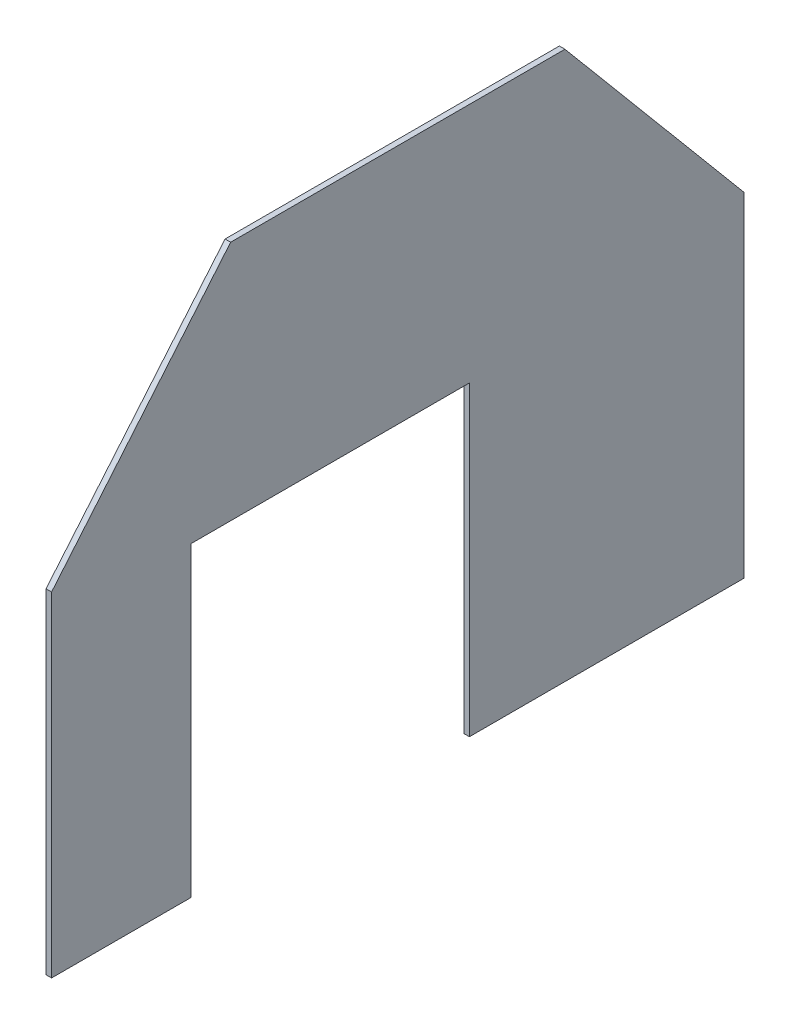
ISO-10303-21;
HEADER;
FILE_DESCRIPTION(('STEP AP214'),'2;1');
FILE_NAME('part.step','',(''),(''),'','','');
FILE_SCHEMA(('AUTOMOTIVE_DESIGN { 1 0 10303 214 1 1 1 1 }'));
ENDSEC;
DATA;
#1=APPLICATION_CONTEXT('core data for automotive mechanical design processes');
#2=APPLICATION_PROTOCOL_DEFINITION('international standard','automotive_design',2000,#1);
#3=PRODUCT_CONTEXT('',#1,'mechanical');
#4=PRODUCT('Part','Part','',(#3));
#5=PRODUCT_RELATED_PRODUCT_CATEGORY('part','',(#4));
#6=PRODUCT_DEFINITION_FORMATION('','',#4);
#7=PRODUCT_DEFINITION_CONTEXT('part definition',#1,'design');
#8=PRODUCT_DEFINITION('design','',#6,#7);
#9=PRODUCT_DEFINITION_SHAPE('','',#8);
#10=(LENGTH_UNIT() NAMED_UNIT(*) SI_UNIT(.MILLI.,.METRE.));
#11=(NAMED_UNIT(*) PLANE_ANGLE_UNIT() SI_UNIT($,.RADIAN.));
#12=(NAMED_UNIT(*) SI_UNIT($,.STERADIAN.) SOLID_ANGLE_UNIT());
#13=UNCERTAINTY_MEASURE_WITH_UNIT(LENGTH_MEASURE(1.E-05),#10,'distance_accuracy_value','');
#14=(GEOMETRIC_REPRESENTATION_CONTEXT(3) GLOBAL_UNCERTAINTY_ASSIGNED_CONTEXT((#13)) GLOBAL_UNIT_ASSIGNED_CONTEXT((#10,
#11,#12)) REPRESENTATION_CONTEXT('',''));
#15=CARTESIAN_POINT('',(0.,0.,0.));
#16=DIRECTION('',(0.,0.,1.));
#17=DIRECTION('',(1.,0.,0.));
#18=AXIS2_PLACEMENT_3D('',#15,#16,#17);
#19=CARTESIAN_POINT('',(-1.,0.,-124.278760968654));
#20=DIRECTION('',(0.,-1.,0.));
#21=DIRECTION('',(0.,0.,-1.));
#22=AXIS2_PLACEMENT_3D('',#19,#20,#21);
#23=PLANE('',#22);
#24=DIRECTION('',(1.,0.,0.));
#25=VECTOR('',#24,1.);
#26=CARTESIAN_POINT('',(-1.,0.,-75.));
#27=LINE('',#26,#25);
#28=CARTESIAN_POINT('',(-1.,0.,-75.));
#29=VERTEX_POINT('',#28);
#30=CARTESIAN_POINT('',(0.,0.,-75.));
#31=VERTEX_POINT('',#30);
#32=EDGE_CURVE('E169',#29,#31,#27,.T.);
#33=ORIENTED_EDGE('',*,*,#32,.F.);
#34=DIRECTION('',(0.,0.,-1.));
#35=VECTOR('',#34,1.);
#36=CARTESIAN_POINT('',(-1.,0.,-124.278760968654));
#37=LINE('',#36,#35);
#38=CARTESIAN_POINT('',(-1.,0.,-124.278760968654));
#39=VERTEX_POINT('',#38);
#40=EDGE_CURVE('E93',#29,#39,#37,.T.);
#41=ORIENTED_EDGE('',*,*,#40,.T.);
#42=DIRECTION('',(1.,0.,0.));
#43=VECTOR('',#42,1.);
#44=CARTESIAN_POINT('',(-1.,0.,-124.278760968654));
#45=LINE('',#44,#43);
#46=CARTESIAN_POINT('',(0.,0.,-124.278760968654));
#47=VERTEX_POINT('',#46);
#48=EDGE_CURVE('E39',#39,#47,#45,.T.);
#49=ORIENTED_EDGE('',*,*,#48,.T.);
#50=DIRECTION('',(0.,0.,-1.));
#51=VECTOR('',#50,1.);
#52=CARTESIAN_POINT('',(0.,0.,-124.278760968654));
#53=LINE('',#52,#51);
#54=EDGE_CURVE('E141',#31,#47,#53,.T.);
#55=ORIENTED_EDGE('',*,*,#54,.F.);
#56=EDGE_LOOP('',(#33,#41,#49,#55));
#57=FACE_BOUND('',#56,.T.);
#58=ADVANCED_FACE('F35',(#57),#23,.T.);
#59=DIRECTION('',(1.,0.,0.));
#60=VECTOR('',#59,1.);
#61=CARTESIAN_POINT('',(-1.,0.,-25.));
#62=LINE('',#61,#60);
#63=CARTESIAN_POINT('',(-1.,0.,-25.));
#64=VERTEX_POINT('',#63);
#65=CARTESIAN_POINT('',(0.,0.,-25.));
#66=VERTEX_POINT('',#65);
#67=EDGE_CURVE('E174',#64,#66,#62,.T.);
#68=ORIENTED_EDGE('',*,*,#67,.T.);
#69=CARTESIAN_POINT('',(0.,0.,0.));
#70=VERTEX_POINT('',#69);
#71=EDGE_CURVE('E137',#70,#66,#53,.T.);
#72=ORIENTED_EDGE('',*,*,#71,.F.);
#73=DIRECTION('',(1.,0.,0.));
#74=VECTOR('',#73,1.);
#75=CARTESIAN_POINT('',(-1.,0.,0.));
#76=LINE('',#75,#74);
#77=CARTESIAN_POINT('',(-1.,0.,0.));
#78=VERTEX_POINT('',#77);
#79=EDGE_CURVE('E11',#78,#70,#76,.T.);
#80=ORIENTED_EDGE('',*,*,#79,.F.);
#81=EDGE_CURVE('E184',#78,#64,#37,.T.);
#82=ORIENTED_EDGE('',*,*,#81,.T.);
#83=EDGE_LOOP('',(#68,#72,#80,#82));
#84=FACE_BOUND('',#83,.T.);
#85=ADVANCED_FACE('F37',(#84),#23,.T.);
#86=CARTESIAN_POINT('',(-1.,0.,0.));
#87=DIRECTION('',(0.,0.,1.));
#88=DIRECTION('',(1.,0.,0.));
#89=AXIS2_PLACEMENT_3D('',#86,#87,#88);
#90=PLANE('',#89);
#91=DIRECTION('',(0.,-1.,0.));
#92=VECTOR('',#91,1.);
#93=CARTESIAN_POINT('',(0.,0.,0.));
#94=LINE('',#93,#92);
#95=CARTESIAN_POINT('',(0.,60.,0.));
#96=VERTEX_POINT('',#95);
#97=EDGE_CURVE('E150',#96,#70,#94,.T.);
#98=ORIENTED_EDGE('',*,*,#97,.F.);
#99=DIRECTION('',(1.,0.,0.));
#100=VECTOR('',#99,1.);
#101=CARTESIAN_POINT('',(-1.,60.,0.));
#102=LINE('',#101,#100);
#103=CARTESIAN_POINT('',(-1.,60.,0.));
#104=VERTEX_POINT('',#103);
#105=EDGE_CURVE('E44',#104,#96,#102,.T.);
#106=ORIENTED_EDGE('',*,*,#105,.F.);
#107=DIRECTION('',(0.,-1.,0.));
#108=VECTOR('',#107,1.);
#109=CARTESIAN_POINT('',(-1.,0.,0.));
#110=LINE('',#109,#108);
#111=EDGE_CURVE('E127',#104,#78,#110,.T.);
#112=ORIENTED_EDGE('',*,*,#111,.T.);
#113=ORIENTED_EDGE('',*,*,#79,.T.);
#114=EDGE_LOOP('',(#98,#106,#112,#113));
#115=FACE_BOUND('',#114,.T.);
#116=ADVANCED_FACE('F188',(#115),#90,.T.);
#117=CARTESIAN_POINT('',(-1.,60.,0.));
#118=DIRECTION('',(0.,0.64278760968654,0.766044443118977));
#119=DIRECTION('',(0.,-0.766044443118977,0.64278760968654));
#120=AXIS2_PLACEMENT_3D('',#117,#118,#119);
#121=PLANE('',#120);
#122=DIRECTION('',(0.,-0.766044443118977,0.64278760968654));
#123=VECTOR('',#122,1.);
#124=CARTESIAN_POINT('',(0.,60.,0.));
#125=LINE('',#124,#123);
#126=CARTESIAN_POINT('',(0.,98.3022221559489,-32.139380484327));
#127=VERTEX_POINT('',#126);
#128=EDGE_CURVE('E113',#127,#96,#125,.T.);
#129=ORIENTED_EDGE('',*,*,#128,.F.);
#130=DIRECTION('',(1.,0.,0.));
#131=VECTOR('',#130,1.);
#132=CARTESIAN_POINT('',(-1.,98.3022221559489,-32.139380484327));
#133=LINE('',#132,#131);
#134=CARTESIAN_POINT('',(-1.,98.3022221559489,-32.139380484327));
#135=VERTEX_POINT('',#134);
#136=EDGE_CURVE('E107',#135,#127,#133,.T.);
#137=ORIENTED_EDGE('',*,*,#136,.F.);
#138=DIRECTION('',(0.,-0.766044443118977,0.64278760968654));
#139=VECTOR('',#138,1.);
#140=CARTESIAN_POINT('',(-1.,60.,0.));
#141=LINE('',#140,#139);
#142=EDGE_CURVE('E110',#135,#104,#141,.T.);
#143=ORIENTED_EDGE('',*,*,#142,.T.);
#144=ORIENTED_EDGE('',*,*,#105,.T.);
#145=EDGE_LOOP('',(#129,#137,#143,#144));
#146=FACE_BOUND('',#145,.T.);
#147=ADVANCED_FACE('F109',(#146),#121,.T.);
#148=CARTESIAN_POINT('',(-1.,98.3022221559489,-32.139380484327));
#149=DIRECTION('',(0.,1.,0.));
#150=DIRECTION('',(0.,0.,1.));
#151=AXIS2_PLACEMENT_3D('',#148,#149,#150);
#152=PLANE('',#151);
#153=DIRECTION('',(0.,0.,1.));
#154=VECTOR('',#153,1.);
#155=CARTESIAN_POINT('',(0.,98.3022221559489,-32.139380484327));
#156=LINE('',#155,#154);
#157=CARTESIAN_POINT('',(0.,98.3022221559488,-92.139380484327));
#158=VERTEX_POINT('',#157);
#159=EDGE_CURVE('E147',#158,#127,#156,.T.);
#160=ORIENTED_EDGE('',*,*,#159,.F.);
#161=DIRECTION('',(1.,0.,0.));
#162=VECTOR('',#161,1.);
#163=CARTESIAN_POINT('',(-1.,98.3022221559488,-92.139380484327));
#164=LINE('',#163,#162);
#165=CARTESIAN_POINT('',(-1.,98.3022221559488,-92.139380484327));
#166=VERTEX_POINT('',#165);
#167=EDGE_CURVE('E118',#166,#158,#164,.T.);
#168=ORIENTED_EDGE('',*,*,#167,.F.);
#169=DIRECTION('',(0.,0.,1.));
#170=VECTOR('',#169,1.);
#171=CARTESIAN_POINT('',(-1.,98.3022221559489,-32.139380484327));
#172=LINE('',#171,#170);
#173=EDGE_CURVE('E125',#166,#135,#172,.T.);
#174=ORIENTED_EDGE('',*,*,#173,.T.);
#175=ORIENTED_EDGE('',*,*,#136,.T.);
#176=EDGE_LOOP('',(#160,#168,#174,#175));
#177=FACE_BOUND('',#176,.T.);
#178=ADVANCED_FACE('F129',(#177),#152,.T.);
#179=CARTESIAN_POINT('',(-1.,98.3022221559488,-92.139380484327));
#180=DIRECTION('',(0.,0.642787609686541,-0.766044443118977));
#181=DIRECTION('',(0.,0.766044443118977,0.642787609686541));
#182=AXIS2_PLACEMENT_3D('',#179,#180,#181);
#183=PLANE('',#182);
#184=DIRECTION('',(0.,0.766044443118977,0.642787609686541));
#185=VECTOR('',#184,1.);
#186=CARTESIAN_POINT('',(0.,98.3022221559488,-92.139380484327));
#187=LINE('',#186,#185);
#188=CARTESIAN_POINT('',(0.,60.,-124.278760968654));
#189=VERTEX_POINT('',#188);
#190=EDGE_CURVE('E144',#189,#158,#187,.T.);
#191=ORIENTED_EDGE('',*,*,#190,.F.);
#192=DIRECTION('',(1.,0.,0.));
#193=VECTOR('',#192,1.);
#194=CARTESIAN_POINT('',(-1.,60.,-124.278760968654));
#195=LINE('',#194,#193);
#196=CARTESIAN_POINT('',(-1.,60.,-124.278760968654));
#197=VERTEX_POINT('',#196);
#198=EDGE_CURVE('E154',#197,#189,#195,.T.);
#199=ORIENTED_EDGE('',*,*,#198,.F.);
#200=DIRECTION('',(0.,0.766044443118977,0.642787609686541));
#201=VECTOR('',#200,1.);
#202=CARTESIAN_POINT('',(-1.,98.3022221559488,-92.139380484327));
#203=LINE('',#202,#201);
#204=EDGE_CURVE('E130',#197,#166,#203,.T.);
#205=ORIENTED_EDGE('',*,*,#204,.T.);
#206=ORIENTED_EDGE('',*,*,#167,.T.);
#207=EDGE_LOOP('',(#191,#199,#205,#206));
#208=FACE_BOUND('',#207,.T.);
#209=ADVANCED_FACE('F187',(#208),#183,.T.);
#210=CARTESIAN_POINT('',(-1.,60.,-124.278760968654));
#211=DIRECTION('',(0.,0.,-1.));
#212=DIRECTION('',(-1.,0.,0.));
#213=AXIS2_PLACEMENT_3D('',#210,#211,#212);
#214=PLANE('',#213);
#215=DIRECTION('',(0.,1.,0.));
#216=VECTOR('',#215,1.);
#217=CARTESIAN_POINT('',(0.,60.,-124.278760968654));
#218=LINE('',#217,#216);
#219=EDGE_CURVE('E140',#47,#189,#218,.T.);
#220=ORIENTED_EDGE('',*,*,#219,.F.);
#221=ORIENTED_EDGE('',*,*,#48,.F.);
#222=DIRECTION('',(0.,1.,0.));
#223=VECTOR('',#222,1.);
#224=CARTESIAN_POINT('',(-1.,60.,-124.278760968654));
#225=LINE('',#224,#223);
#226=EDGE_CURVE('E132',#39,#197,#225,.T.);
#227=ORIENTED_EDGE('',*,*,#226,.T.);
#228=ORIENTED_EDGE('',*,*,#198,.T.);
#229=EDGE_LOOP('',(#220,#221,#227,#228));
#230=FACE_BOUND('',#229,.T.);
#231=ADVANCED_FACE('F162',(#230),#214,.T.);
#232=CARTESIAN_POINT('',(-1.,0.,0.));
#233=DIRECTION('',(-1.,0.,0.));
#234=DIRECTION('',(0.,0.,1.));
#235=AXIS2_PLACEMENT_3D('',#232,#233,#234);
#236=PLANE('',#235);
#237=DIRECTION('',(0.,1.,0.));
#238=VECTOR('',#237,1.);
#239=CARTESIAN_POINT('',(-1.,55.,-75.));
#240=LINE('',#239,#238);
#241=CARTESIAN_POINT('',(-1.,55.,-75.));
#242=VERTEX_POINT('',#241);
#243=EDGE_CURVE('E183',#29,#242,#240,.T.);
#244=ORIENTED_EDGE('',*,*,#243,.T.);
#245=DIRECTION('',(0.,0.,1.));
#246=VECTOR('',#245,1.);
#247=CARTESIAN_POINT('',(-1.,55.,-25.));
#248=LINE('',#247,#246);
#249=CARTESIAN_POINT('',(-1.,55.,-25.));
#250=VERTEX_POINT('',#249);
#251=EDGE_CURVE('E269',#242,#250,#248,.T.);
#252=ORIENTED_EDGE('',*,*,#251,.T.);
#253=DIRECTION('',(0.,-1.,0.));
#254=VECTOR('',#253,1.);
#255=CARTESIAN_POINT('',(-1.,55.,-25.));
#256=LINE('',#255,#254);
#257=EDGE_CURVE('E268',#250,#64,#256,.T.);
#258=ORIENTED_EDGE('',*,*,#257,.T.);
#259=ORIENTED_EDGE('',*,*,#81,.F.);
#260=ORIENTED_EDGE('',*,*,#111,.F.);
#261=ORIENTED_EDGE('',*,*,#142,.F.);
#262=ORIENTED_EDGE('',*,*,#173,.F.);
#263=ORIENTED_EDGE('',*,*,#204,.F.);
#264=ORIENTED_EDGE('',*,*,#226,.F.);
#265=ORIENTED_EDGE('',*,*,#40,.F.);
#266=EDGE_LOOP('',(#244,#252,#258,#259,#260,#261,#262,#263,#264,#265));
#267=FACE_BOUND('',#266,.T.);
#268=ADVANCED_FACE('F123',(#267),#236,.T.);
#269=CARTESIAN_POINT('',(0.,0.,0.));
#270=DIRECTION('',(-1.,0.,0.));
#271=DIRECTION('',(0.,0.,1.));
#272=AXIS2_PLACEMENT_3D('',#269,#270,#271);
#273=PLANE('',#272);
#274=DIRECTION('',(0.,0.,1.));
#275=VECTOR('',#274,1.);
#276=CARTESIAN_POINT('',(0.,55.,-25.));
#277=LINE('',#276,#275);
#278=CARTESIAN_POINT('',(0.,55.,-75.));
#279=VERTEX_POINT('',#278);
#280=CARTESIAN_POINT('',(0.,55.,-25.));
#281=VERTEX_POINT('',#280);
#282=EDGE_CURVE('E52',#279,#281,#277,.T.);
#283=ORIENTED_EDGE('',*,*,#282,.F.);
#284=DIRECTION('',(0.,1.,0.));
#285=VECTOR('',#284,1.);
#286=CARTESIAN_POINT('',(0.,55.,-75.));
#287=LINE('',#286,#285);
#288=EDGE_CURVE('E167',#31,#279,#287,.T.);
#289=ORIENTED_EDGE('',*,*,#288,.F.);
#290=ORIENTED_EDGE('',*,*,#54,.T.);
#291=ORIENTED_EDGE('',*,*,#219,.T.);
#292=ORIENTED_EDGE('',*,*,#190,.T.);
#293=ORIENTED_EDGE('',*,*,#159,.T.);
#294=ORIENTED_EDGE('',*,*,#128,.T.);
#295=ORIENTED_EDGE('',*,*,#97,.T.);
#296=ORIENTED_EDGE('',*,*,#71,.T.);
#297=DIRECTION('',(0.,-1.,0.));
#298=VECTOR('',#297,1.);
#299=CARTESIAN_POINT('',(0.,55.,-25.));
#300=LINE('',#299,#298);
#301=EDGE_CURVE('E260',#281,#66,#300,.T.);
#302=ORIENTED_EDGE('',*,*,#301,.F.);
#303=EDGE_LOOP('',(#283,#289,#290,#291,#292,#293,#294,#295,#296,#302));
#304=FACE_BOUND('',#303,.T.);
#305=ADVANCED_FACE('F164',(#304),#273,.F.);
#306=CARTESIAN_POINT('',(-1.,55.,-25.));
#307=DIRECTION('',(0.,1.,0.));
#308=DIRECTION('',(0.,0.,1.));
#309=AXIS2_PLACEMENT_3D('',#306,#307,#308);
#310=PLANE('',#309);
#311=ORIENTED_EDGE('',*,*,#282,.T.);
#312=DIRECTION('',(1.,0.,0.));
#313=VECTOR('',#312,1.);
#314=CARTESIAN_POINT('',(-1.,55.,-25.));
#315=LINE('',#314,#313);
#316=EDGE_CURVE('E181',#250,#281,#315,.T.);
#317=ORIENTED_EDGE('',*,*,#316,.F.);
#318=ORIENTED_EDGE('',*,*,#251,.F.);
#319=DIRECTION('',(1.,0.,0.));
#320=VECTOR('',#319,1.);
#321=CARTESIAN_POINT('',(-1.,55.,-75.));
#322=LINE('',#321,#320);
#323=EDGE_CURVE('E168',#242,#279,#322,.T.);
#324=ORIENTED_EDGE('',*,*,#323,.T.);
#325=EDGE_LOOP('',(#311,#317,#318,#324));
#326=FACE_BOUND('',#325,.T.);
#327=ADVANCED_FACE('F225',(#326),#310,.F.);
#328=CARTESIAN_POINT('',(-1.,55.,-75.));
#329=DIRECTION('',(0.,0.,-1.));
#330=DIRECTION('',(-1.,0.,0.));
#331=AXIS2_PLACEMENT_3D('',#328,#329,#330);
#332=PLANE('',#331);
#333=ORIENTED_EDGE('',*,*,#288,.T.);
#334=ORIENTED_EDGE('',*,*,#323,.F.);
#335=ORIENTED_EDGE('',*,*,#243,.F.);
#336=ORIENTED_EDGE('',*,*,#32,.T.);
#337=EDGE_LOOP('',(#333,#334,#335,#336));
#338=FACE_BOUND('',#337,.T.);
#339=ADVANCED_FACE('F233',(#338),#332,.F.);
#340=CARTESIAN_POINT('',(-1.,55.,-25.));
#341=DIRECTION('',(0.,0.,1.));
#342=DIRECTION('',(0.,-1.,0.));
#343=AXIS2_PLACEMENT_3D('',#340,#341,#342);
#344=PLANE('',#343);
#345=ORIENTED_EDGE('',*,*,#301,.T.);
#346=ORIENTED_EDGE('',*,*,#67,.F.);
#347=ORIENTED_EDGE('',*,*,#257,.F.);
#348=ORIENTED_EDGE('',*,*,#316,.T.);
#349=EDGE_LOOP('',(#345,#346,#347,#348));
#350=FACE_BOUND('',#349,.T.);
#351=ADVANCED_FACE('F242',(#350),#344,.F.);
#352=CLOSED_SHELL('',(#58,#85,#116,#147,#178,#209,#231,#268,#305,#327,#339,#351));
#353=MANIFOLD_SOLID_BREP('B2',#352);
#354=ADVANCED_BREP_SHAPE_REPRESENTATION('',(#18,#353),#14);
#355=SHAPE_DEFINITION_REPRESENTATION(#9,#354);
ENDSEC;
END-ISO-10303-21;
